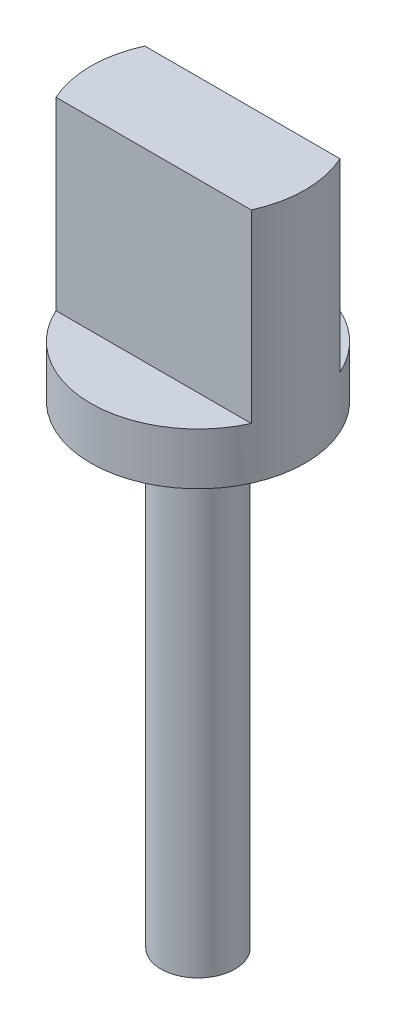
ISO-10303-21;
HEADER;
FILE_DESCRIPTION(('STEP AP214'),'2;1');
FILE_NAME('part.step','',(''),(''),'','','');
FILE_SCHEMA(('AUTOMOTIVE_DESIGN { 1 0 10303 214 1 1 1 1 }'));
ENDSEC;
DATA;
#1=APPLICATION_CONTEXT('core data for automotive mechanical design processes');
#2=APPLICATION_PROTOCOL_DEFINITION('international standard','automotive_design',2000,#1);
#3=PRODUCT_CONTEXT('',#1,'mechanical');
#4=PRODUCT('Part','Part','',(#3));
#5=PRODUCT_RELATED_PRODUCT_CATEGORY('part','',(#4));
#6=PRODUCT_DEFINITION_FORMATION('','',#4);
#7=PRODUCT_DEFINITION_CONTEXT('part definition',#1,'design');
#8=PRODUCT_DEFINITION('design','',#6,#7);
#9=PRODUCT_DEFINITION_SHAPE('','',#8);
#10=(LENGTH_UNIT() NAMED_UNIT(*) SI_UNIT(.MILLI.,.METRE.));
#11=(NAMED_UNIT(*) PLANE_ANGLE_UNIT() SI_UNIT($,.RADIAN.));
#12=(NAMED_UNIT(*) SI_UNIT($,.STERADIAN.) SOLID_ANGLE_UNIT());
#13=UNCERTAINTY_MEASURE_WITH_UNIT(LENGTH_MEASURE(1.E-05),#10,'distance_accuracy_value','');
#14=(GEOMETRIC_REPRESENTATION_CONTEXT(3) GLOBAL_UNCERTAINTY_ASSIGNED_CONTEXT((#13)) GLOBAL_UNIT_ASSIGNED_CONTEXT((#10,
#11,#12)) REPRESENTATION_CONTEXT('',''));
#15=CARTESIAN_POINT('',(0.,0.,0.));
#16=DIRECTION('',(0.,0.,1.));
#17=DIRECTION('',(1.,0.,0.));
#18=AXIS2_PLACEMENT_3D('',#15,#16,#17);
#19=CARTESIAN_POINT('',(0.,10.7,0.));
#20=DIRECTION('',(0.,-1.,0.));
#21=DIRECTION('',(0.,0.,-1.));
#22=AXIS2_PLACEMENT_3D('',#19,#20,#21);
#23=CYLINDRICAL_SURFACE('',#22,1.45);
#24=DIRECTION('',(0.,-1.,0.));
#25=VECTOR('',#24,1.);
#26=CARTESIAN_POINT('',(1.32003787824441,10.7,-0.6));
#27=LINE('',#26,#25);
#28=CARTESIAN_POINT('',(1.32003787824441,0.699999999999989,-0.6));
#29=VERTEX_POINT('',#28);
#30=CARTESIAN_POINT('',(1.32003787824441,3.19999999999998,-0.6));
#31=VERTEX_POINT('',#30);
#32=EDGE_CURVE('E97',#29,#31,#27,.F.);
#33=ORIENTED_EDGE('',*,*,#32,.T.);
#34=CARTESIAN_POINT('',(0.,3.19999999999998,0.));
#35=DIRECTION('',(0.,-1.,0.));
#36=DIRECTION('',(0.,0.,-1.));
#37=AXIS2_PLACEMENT_3D('',#34,#35,#36);
#38=CIRCLE('',#37,1.45);
#39=CARTESIAN_POINT('',(1.32003787824441,3.19999999999998,0.6));
#40=VERTEX_POINT('',#39);
#41=EDGE_CURVE('E90',#31,#40,#38,.T.);
#42=ORIENTED_EDGE('',*,*,#41,.T.);
#43=DIRECTION('',(0.,-1.,0.));
#44=VECTOR('',#43,1.);
#45=CARTESIAN_POINT('',(1.32003787824441,10.7,0.6));
#46=LINE('',#45,#44);
#47=CARTESIAN_POINT('',(1.32003787824441,0.69999999999999,0.6));
#48=VERTEX_POINT('',#47);
#49=EDGE_CURVE('E72',#40,#48,#46,.T.);
#50=ORIENTED_EDGE('',*,*,#49,.T.);
#51=CARTESIAN_POINT('',(0.,0.699999999999989,0.));
#52=DIRECTION('',(0.,1.,0.));
#53=DIRECTION('',(0.,0.,1.));
#54=AXIS2_PLACEMENT_3D('',#51,#52,#53);
#55=CIRCLE('',#54,1.45);
#56=CARTESIAN_POINT('',(-1.32003787824441,0.699999999999989,0.6));
#57=VERTEX_POINT('',#56);
#58=EDGE_CURVE('E58',#57,#48,#55,.T.);
#59=ORIENTED_EDGE('',*,*,#58,.F.);
#60=DIRECTION('',(0.,-1.,0.));
#61=VECTOR('',#60,1.);
#62=CARTESIAN_POINT('',(-1.32003787824441,10.7,0.6));
#63=LINE('',#62,#61);
#64=CARTESIAN_POINT('',(-1.32003787824441,3.19999999999998,0.6));
#65=VERTEX_POINT('',#64);
#66=EDGE_CURVE('E105',#57,#65,#63,.F.);
#67=ORIENTED_EDGE('',*,*,#66,.T.);
#68=CARTESIAN_POINT('',(-1.32003787824441,3.19999999999998,-0.6));
#69=VERTEX_POINT('',#68);
#70=EDGE_CURVE('E65',#65,#69,#38,.T.);
#71=ORIENTED_EDGE('',*,*,#70,.T.);
#72=DIRECTION('',(0.,-1.,0.));
#73=VECTOR('',#72,1.);
#74=CARTESIAN_POINT('',(-1.32003787824441,10.7,-0.6));
#75=LINE('',#74,#73);
#76=CARTESIAN_POINT('',(-1.32003787824441,0.699999999999988,-0.6));
#77=VERTEX_POINT('',#76);
#78=EDGE_CURVE('E110',#69,#77,#75,.T.);
#79=ORIENTED_EDGE('',*,*,#78,.T.);
#80=CARTESIAN_POINT('',(0.,0.699999999999989,0.));
#81=DIRECTION('',(0.,1.,0.));
#82=DIRECTION('',(0.,0.,1.));
#83=AXIS2_PLACEMENT_3D('',#80,#81,#82);
#84=CIRCLE('',#83,1.45);
#85=EDGE_CURVE('E117',#29,#77,#84,.T.);
#86=ORIENTED_EDGE('',*,*,#85,.F.);
#87=EDGE_LOOP('',(#33,#42,#50,#59,#67,#71,#79,#86));
#88=FACE_BOUND('',#87,.T.);
#89=CARTESIAN_POINT('',(0.,0.,0.));
#90=DIRECTION('',(0.,1.,0.));
#91=DIRECTION('',(0.,0.,1.));
#92=AXIS2_PLACEMENT_3D('',#89,#90,#91);
#93=CIRCLE('',#92,1.45);
#94=CARTESIAN_POINT('',(0.,0.,1.45));
#95=VERTEX_POINT('',#94);
#96=EDGE_CURVE('E108',#95,#95,#93,.T.);
#97=ORIENTED_EDGE('',*,*,#96,.T.);
#98=EDGE_LOOP('',(#97));
#99=FACE_BOUND('',#98,.T.);
#100=ADVANCED_FACE('F51',(#88,#99),#23,.T.);
#101=CARTESIAN_POINT('',(0.,0.,0.));
#102=DIRECTION('',(0.,1.,0.));
#103=DIRECTION('',(0.,0.,1.));
#104=AXIS2_PLACEMENT_3D('',#101,#102,#103);
#105=PLANE('',#104);
#106=CARTESIAN_POINT('',(0.,0.,0.));
#107=DIRECTION('',(0.,-1.,0.));
#108=DIRECTION('',(0.,0.,-1.));
#109=AXIS2_PLACEMENT_3D('',#106,#107,#108);
#110=CIRCLE('',#109,0.5);
#111=CARTESIAN_POINT('',(0.,0.,-0.5));
#112=VERTEX_POINT('',#111);
#113=EDGE_CURVE('E114',#112,#112,#110,.T.);
#114=ORIENTED_EDGE('',*,*,#113,.F.);
#115=EDGE_LOOP('',(#114));
#116=FACE_BOUND('',#115,.T.);
#117=ORIENTED_EDGE('',*,*,#96,.F.);
#118=EDGE_LOOP('',(#117));
#119=FACE_BOUND('',#118,.T.);
#120=ADVANCED_FACE('F149',(#116,#119),#105,.F.);
#121=CARTESIAN_POINT('',(0.,-6.4,0.));
#122=DIRECTION('',(0.,1.,0.));
#123=DIRECTION('',(0.,0.,1.));
#124=AXIS2_PLACEMENT_3D('',#121,#122,#123);
#125=CYLINDRICAL_SURFACE('',#124,0.5);
#126=CARTESIAN_POINT('',(0.,-6.4,0.));
#127=DIRECTION('',(0.,-1.,0.));
#128=DIRECTION('',(0.,0.,-1.));
#129=AXIS2_PLACEMENT_3D('',#126,#127,#128);
#130=CIRCLE('',#129,0.5);
#131=CARTESIAN_POINT('',(0.,-6.4,-0.5));
#132=VERTEX_POINT('',#131);
#133=EDGE_CURVE('E104',#132,#132,#130,.T.);
#134=ORIENTED_EDGE('',*,*,#133,.F.);
#135=EDGE_LOOP('',(#134));
#136=FACE_BOUND('',#135,.T.);
#137=ORIENTED_EDGE('',*,*,#113,.T.);
#138=EDGE_LOOP('',(#137));
#139=FACE_BOUND('',#138,.T.);
#140=ADVANCED_FACE('F145',(#136,#139),#125,.T.);
#141=CARTESIAN_POINT('',(0.,-6.4,0.));
#142=DIRECTION('',(0.,-1.,0.));
#143=DIRECTION('',(0.,0.,-1.));
#144=AXIS2_PLACEMENT_3D('',#141,#142,#143);
#145=PLANE('',#144);
#146=ORIENTED_EDGE('',*,*,#133,.T.);
#147=EDGE_LOOP('',(#146));
#148=FACE_BOUND('',#147,.T.);
#149=ADVANCED_FACE('F136',(#148),#145,.T.);
#150=CARTESIAN_POINT('',(0.,0.699999999999989,0.));
#151=DIRECTION('',(0.,1.,0.));
#152=DIRECTION('',(-0.356848198609269,0.,-0.934162385856613));
#153=AXIS2_PLACEMENT_3D('',#150,#151,#152);
#154=PLANE('',#153);
#155=ORIENTED_EDGE('',*,*,#85,.T.);
#156=DIRECTION('',(-1.,0.,0.));
#157=VECTOR('',#156,1.);
#158=CARTESIAN_POINT('',(-1.94278243682566,0.699999999999987,-0.6));
#159=LINE('',#158,#157);
#160=EDGE_CURVE('E98',#29,#77,#159,.T.);
#161=ORIENTED_EDGE('',*,*,#160,.F.);
#162=EDGE_LOOP('',(#155,#161));
#163=FACE_BOUND('',#162,.T.);
#164=ADVANCED_FACE('F134',(#163),#154,.T.);
#165=CARTESIAN_POINT('',(-1.94278243682566,-3.44150094019222,-0.6));
#166=DIRECTION('',(0.,0.,1.));
#167=DIRECTION('',(1.,0.,0.));
#168=AXIS2_PLACEMENT_3D('',#165,#166,#167);
#169=PLANE('',#168);
#170=ORIENTED_EDGE('',*,*,#78,.F.);
#171=DIRECTION('',(1.,0.,0.));
#172=VECTOR('',#171,1.);
#173=CARTESIAN_POINT('',(-1.94278243682566,3.19999999999998,-0.6));
#174=LINE('',#173,#172);
#175=EDGE_CURVE('E124',#69,#31,#174,.T.);
#176=ORIENTED_EDGE('',*,*,#175,.T.);
#177=ORIENTED_EDGE('',*,*,#32,.F.);
#178=ORIENTED_EDGE('',*,*,#160,.T.);
#179=EDGE_LOOP('',(#170,#176,#177,#178));
#180=FACE_BOUND('',#179,.T.);
#181=ADVANCED_FACE('F127',(#180),#169,.F.);
#182=CARTESIAN_POINT('',(0.,0.699999999999989,0.));
#183=DIRECTION('',(0.,1.,0.));
#184=DIRECTION('',(-0.356848198609269,0.,-0.934162385856613));
#185=AXIS2_PLACEMENT_3D('',#182,#183,#184);
#186=PLANE('',#185);
#187=ORIENTED_EDGE('',*,*,#58,.T.);
#188=DIRECTION('',(1.,0.,0.));
#189=VECTOR('',#188,1.);
#190=CARTESIAN_POINT('',(-1.94278243682566,0.699999999999989,0.6));
#191=LINE('',#190,#189);
#192=EDGE_CURVE('E103',#57,#48,#191,.T.);
#193=ORIENTED_EDGE('',*,*,#192,.F.);
#194=EDGE_LOOP('',(#187,#193));
#195=FACE_BOUND('',#194,.T.);
#196=ADVANCED_FACE('F122',(#195),#186,.T.);
#197=CARTESIAN_POINT('',(-1.94278243682566,-3.44150094019222,0.6));
#198=DIRECTION('',(0.,0.,-1.));
#199=DIRECTION('',(-1.,0.,0.));
#200=AXIS2_PLACEMENT_3D('',#197,#198,#199);
#201=PLANE('',#200);
#202=ORIENTED_EDGE('',*,*,#49,.F.);
#203=DIRECTION('',(-1.,0.,0.));
#204=VECTOR('',#203,1.);
#205=CARTESIAN_POINT('',(-1.94278243682566,3.19999999999998,0.6));
#206=LINE('',#205,#204);
#207=EDGE_CURVE('E11',#40,#65,#206,.T.);
#208=ORIENTED_EDGE('',*,*,#207,.T.);
#209=ORIENTED_EDGE('',*,*,#66,.F.);
#210=ORIENTED_EDGE('',*,*,#192,.T.);
#211=EDGE_LOOP('',(#202,#208,#209,#210));
#212=FACE_BOUND('',#211,.T.);
#213=ADVANCED_FACE('F101',(#212),#201,.F.);
#214=CARTESIAN_POINT('',(-3.14730711494194,3.19999999999998,-1.45));
#215=DIRECTION('',(0.,-1.,0.));
#216=DIRECTION('',(0.,0.,-1.));
#217=AXIS2_PLACEMENT_3D('',#214,#215,#216);
#218=PLANE('',#217);
#219=ORIENTED_EDGE('',*,*,#175,.F.);
#220=ORIENTED_EDGE('',*,*,#70,.F.);
#221=ORIENTED_EDGE('',*,*,#207,.F.);
#222=ORIENTED_EDGE('',*,*,#41,.F.);
#223=EDGE_LOOP('',(#219,#220,#221,#222));
#224=FACE_BOUND('',#223,.T.);
#225=ADVANCED_FACE('F89',(#224),#218,.F.);
#226=CLOSED_SHELL('',(#100,#120,#140,#149,#164,#181,#196,#213,#225));
#227=MANIFOLD_SOLID_BREP('B2',#226);
#228=ADVANCED_BREP_SHAPE_REPRESENTATION('',(#18,#227),#14);
#229=SHAPE_DEFINITION_REPRESENTATION(#9,#228);
ENDSEC;
END-ISO-10303-21;
